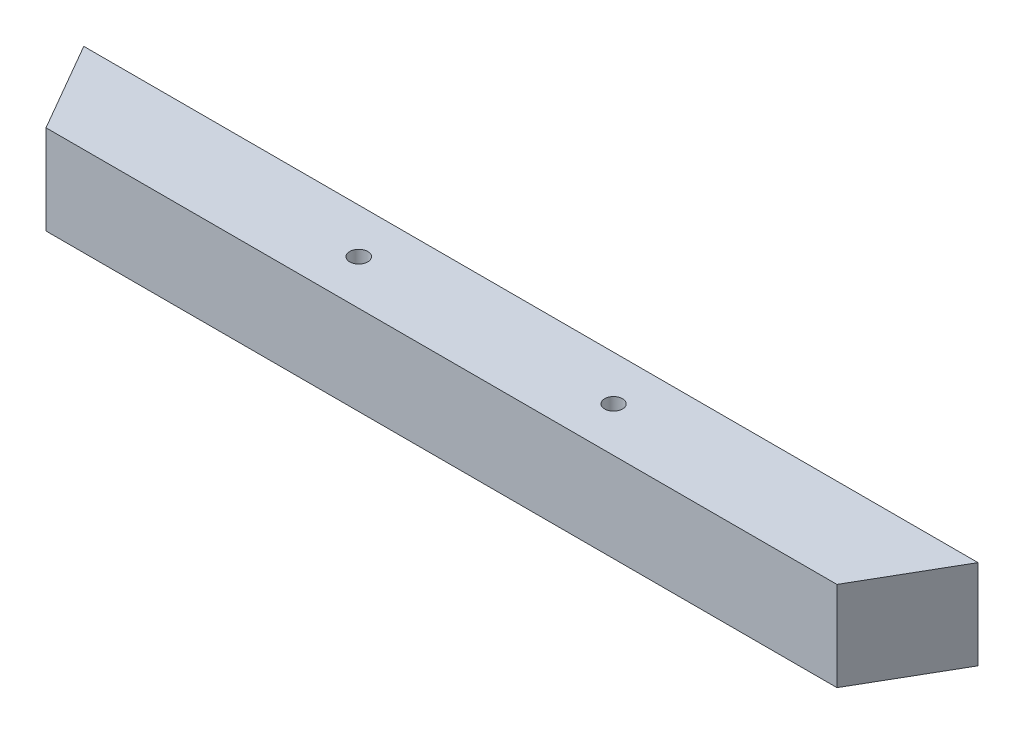
ISO-10303-21;
HEADER;
FILE_DESCRIPTION(('STEP AP214'),'2;1');
FILE_NAME('part.step','',(''),(''),'','','');
FILE_SCHEMA(('AUTOMOTIVE_DESIGN { 1 0 10303 214 1 1 1 1 }'));
ENDSEC;
DATA;
#1=APPLICATION_CONTEXT('core data for automotive mechanical design processes');
#2=APPLICATION_PROTOCOL_DEFINITION('international standard','automotive_design',2000,#1);
#3=PRODUCT_CONTEXT('',#1,'mechanical');
#4=PRODUCT('Part','Part','',(#3));
#5=PRODUCT_RELATED_PRODUCT_CATEGORY('part','',(#4));
#6=PRODUCT_DEFINITION_FORMATION('','',#4);
#7=PRODUCT_DEFINITION_CONTEXT('part definition',#1,'design');
#8=PRODUCT_DEFINITION('design','',#6,#7);
#9=PRODUCT_DEFINITION_SHAPE('','',#8);
#10=(LENGTH_UNIT() NAMED_UNIT(*) SI_UNIT(.MILLI.,.METRE.));
#11=(NAMED_UNIT(*) PLANE_ANGLE_UNIT() SI_UNIT($,.RADIAN.));
#12=(NAMED_UNIT(*) SI_UNIT($,.STERADIAN.) SOLID_ANGLE_UNIT());
#13=UNCERTAINTY_MEASURE_WITH_UNIT(LENGTH_MEASURE(1.E-05),#10,'distance_accuracy_value','');
#14=(GEOMETRIC_REPRESENTATION_CONTEXT(3) GLOBAL_UNCERTAINTY_ASSIGNED_CONTEXT((#13)) GLOBAL_UNIT_ASSIGNED_CONTEXT((#10,
#11,#12)) REPRESENTATION_CONTEXT('',''));
#15=CARTESIAN_POINT('',(0.,0.,0.));
#16=DIRECTION('',(0.,0.,1.));
#17=DIRECTION('',(1.,0.,0.));
#18=AXIS2_PLACEMENT_3D('',#15,#16,#17);
#19=CARTESIAN_POINT('',(0.,20.,0.));
#20=DIRECTION('',(0.,1.,0.));
#21=DIRECTION('',(0.,0.,1.));
#22=AXIS2_PLACEMENT_3D('',#19,#20,#21);
#23=PLANE('',#22);
#24=CARTESIAN_POINT('',(-28.5,20.,10.));
#25=DIRECTION('',(0.,1.,0.));
#26=DIRECTION('',(0.,0.,1.));
#27=AXIS2_PLACEMENT_3D('',#24,#25,#26);
#28=CIRCLE('',#27,2.01959555558853);
#29=CARTESIAN_POINT('',(-28.5,20.,12.0195955555885));
#30=VERTEX_POINT('',#29);
#31=EDGE_CURVE('E110',#30,#30,#28,.T.);
#32=ORIENTED_EDGE('',*,*,#31,.F.);
#33=EDGE_LOOP('',(#32));
#34=FACE_BOUND('',#33,.T.);
#35=DIRECTION('',(0.500000000000004,0.,-0.866025403784436));
#36=VECTOR('',#35,1.);
#37=CARTESIAN_POINT('',(100.,20.,0.));
#38=LINE('',#37,#36);
#39=CARTESIAN_POINT('',(88.4529946162073,20.,20.));
#40=VERTEX_POINT('',#39);
#41=CARTESIAN_POINT('',(100.,20.,0.));
#42=VERTEX_POINT('',#41);
#43=EDGE_CURVE('E95',#40,#42,#38,.T.);
#44=ORIENTED_EDGE('',*,*,#43,.T.);
#45=DIRECTION('',(-1.,0.,0.));
#46=VECTOR('',#45,1.);
#47=CARTESIAN_POINT('',(-100.,20.,0.));
#48=LINE('',#47,#46);
#49=CARTESIAN_POINT('',(-100.,20.,0.));
#50=VERTEX_POINT('',#49);
#51=EDGE_CURVE('E90',#42,#50,#48,.T.);
#52=ORIENTED_EDGE('',*,*,#51,.T.);
#53=DIRECTION('',(0.499999999999998,0.,0.86602540378444));
#54=VECTOR('',#53,1.);
#55=CARTESIAN_POINT('',(-100.,20.,0.));
#56=LINE('',#55,#54);
#57=CARTESIAN_POINT('',(-88.4529946162075,20.,20.));
#58=VERTEX_POINT('',#57);
#59=EDGE_CURVE('E93',#50,#58,#56,.T.);
#60=ORIENTED_EDGE('',*,*,#59,.T.);
#61=DIRECTION('',(1.,0.,0.));
#62=VECTOR('',#61,1.);
#63=CARTESIAN_POINT('',(-88.4529946162075,20.,20.));
#64=LINE('',#63,#62);
#65=EDGE_CURVE('E60',#58,#40,#64,.T.);
#66=ORIENTED_EDGE('',*,*,#65,.T.);
#67=EDGE_LOOP('',(#44,#52,#60,#66));
#68=FACE_BOUND('',#67,.T.);
#69=CARTESIAN_POINT('',(28.5,20.,9.99999999999999));
#70=DIRECTION('',(0.,1.,0.));
#71=DIRECTION('',(0.,0.,1.));
#72=AXIS2_PLACEMENT_3D('',#69,#70,#71);
#73=CIRCLE('',#72,2.);
#74=CARTESIAN_POINT('',(28.5,20.,12.));
#75=VERTEX_POINT('',#74);
#76=EDGE_CURVE('E125',#75,#75,#73,.T.);
#77=ORIENTED_EDGE('',*,*,#76,.F.);
#78=EDGE_LOOP('',(#77));
#79=FACE_BOUND('',#78,.T.);
#80=ADVANCED_FACE('F43',(#34,#68,#79),#23,.T.);
#81=CARTESIAN_POINT('',(0.,0.,0.));
#82=DIRECTION('',(0.,1.,0.));
#83=DIRECTION('',(0.,0.,1.));
#84=AXIS2_PLACEMENT_3D('',#81,#82,#83);
#85=PLANE('',#84);
#86=DIRECTION('',(0.500000000000004,0.,-0.866025403784436));
#87=VECTOR('',#86,1.);
#88=CARTESIAN_POINT('',(100.,0.,0.));
#89=LINE('',#88,#87);
#90=CARTESIAN_POINT('',(88.4529946162073,0.,20.));
#91=VERTEX_POINT('',#90);
#92=CARTESIAN_POINT('',(100.,0.,0.));
#93=VERTEX_POINT('',#92);
#94=EDGE_CURVE('E107',#91,#93,#89,.T.);
#95=ORIENTED_EDGE('',*,*,#94,.F.);
#96=DIRECTION('',(1.,0.,0.));
#97=VECTOR('',#96,1.);
#98=CARTESIAN_POINT('',(-88.4529946162075,0.,20.));
#99=LINE('',#98,#97);
#100=CARTESIAN_POINT('',(-88.4529946162075,0.,20.));
#101=VERTEX_POINT('',#100);
#102=EDGE_CURVE('E83',#101,#91,#99,.T.);
#103=ORIENTED_EDGE('',*,*,#102,.F.);
#104=DIRECTION('',(0.499999999999998,0.,0.86602540378444));
#105=VECTOR('',#104,1.);
#106=CARTESIAN_POINT('',(-100.,0.,0.));
#107=LINE('',#106,#105);
#108=CARTESIAN_POINT('',(-100.,0.,0.));
#109=VERTEX_POINT('',#108);
#110=EDGE_CURVE('E77',#109,#101,#107,.T.);
#111=ORIENTED_EDGE('',*,*,#110,.F.);
#112=DIRECTION('',(-1.,0.,0.));
#113=VECTOR('',#112,1.);
#114=CARTESIAN_POINT('',(-100.,0.,0.));
#115=LINE('',#114,#113);
#116=EDGE_CURVE('E99',#93,#109,#115,.T.);
#117=ORIENTED_EDGE('',*,*,#116,.F.);
#118=EDGE_LOOP('',(#95,#103,#111,#117));
#119=FACE_BOUND('',#118,.T.);
#120=CARTESIAN_POINT('',(-28.5,0.,10.));
#121=DIRECTION('',(0.,1.,0.));
#122=DIRECTION('',(0.,0.,1.));
#123=AXIS2_PLACEMENT_3D('',#120,#121,#122);
#124=CIRCLE('',#123,2.01959555558853);
#125=CARTESIAN_POINT('',(-28.5,0.,12.0195955555885));
#126=VERTEX_POINT('',#125);
#127=EDGE_CURVE('E122',#126,#126,#124,.T.);
#128=ORIENTED_EDGE('',*,*,#127,.T.);
#129=EDGE_LOOP('',(#128));
#130=FACE_BOUND('',#129,.T.);
#131=CARTESIAN_POINT('',(28.5,0.,9.99999999999999));
#132=DIRECTION('',(0.,1.,0.));
#133=DIRECTION('',(0.,0.,1.));
#134=AXIS2_PLACEMENT_3D('',#131,#132,#133);
#135=CIRCLE('',#134,2.);
#136=CARTESIAN_POINT('',(28.5,0.,12.));
#137=VERTEX_POINT('',#136);
#138=EDGE_CURVE('E128',#137,#137,#135,.T.);
#139=ORIENTED_EDGE('',*,*,#138,.T.);
#140=EDGE_LOOP('',(#139));
#141=FACE_BOUND('',#140,.T.);
#142=ADVANCED_FACE('F118',(#119,#130,#141),#85,.F.);
#143=CARTESIAN_POINT('',(100.,20.,0.));
#144=DIRECTION('',(-0.866025403784436,0.,-0.500000000000004));
#145=DIRECTION('',(-0.500000000000004,0.,0.866025403784436));
#146=AXIS2_PLACEMENT_3D('',#143,#144,#145);
#147=PLANE('',#146);
#148=ORIENTED_EDGE('',*,*,#94,.T.);
#149=DIRECTION('',(0.,-1.,0.));
#150=VECTOR('',#149,1.);
#151=CARTESIAN_POINT('',(100.,20.,0.));
#152=LINE('',#151,#150);
#153=EDGE_CURVE('E13',#42,#93,#152,.T.);
#154=ORIENTED_EDGE('',*,*,#153,.F.);
#155=ORIENTED_EDGE('',*,*,#43,.F.);
#156=DIRECTION('',(0.,-1.,0.));
#157=VECTOR('',#156,1.);
#158=CARTESIAN_POINT('',(88.4529946162073,20.,20.));
#159=LINE('',#158,#157);
#160=EDGE_CURVE('E103',#40,#91,#159,.T.);
#161=ORIENTED_EDGE('',*,*,#160,.T.);
#162=EDGE_LOOP('',(#148,#154,#155,#161));
#163=FACE_BOUND('',#162,.T.);
#164=ADVANCED_FACE('F45',(#163),#147,.F.);
#165=CARTESIAN_POINT('',(-100.,20.,0.));
#166=DIRECTION('',(0.,0.,1.));
#167=DIRECTION('',(1.,0.,0.));
#168=AXIS2_PLACEMENT_3D('',#165,#166,#167);
#169=PLANE('',#168);
#170=ORIENTED_EDGE('',*,*,#116,.T.);
#171=DIRECTION('',(0.,-1.,0.));
#172=VECTOR('',#171,1.);
#173=CARTESIAN_POINT('',(-100.,20.,0.));
#174=LINE('',#173,#172);
#175=EDGE_CURVE('E52',#50,#109,#174,.T.);
#176=ORIENTED_EDGE('',*,*,#175,.F.);
#177=ORIENTED_EDGE('',*,*,#51,.F.);
#178=ORIENTED_EDGE('',*,*,#153,.T.);
#179=EDGE_LOOP('',(#170,#176,#177,#178));
#180=FACE_BOUND('',#179,.T.);
#181=ADVANCED_FACE('F98',(#180),#169,.F.);
#182=CARTESIAN_POINT('',(-100.,20.,0.));
#183=DIRECTION('',(0.86602540378444,0.,-0.499999999999998));
#184=DIRECTION('',(-0.499999999999998,0.,-0.86602540378444));
#185=AXIS2_PLACEMENT_3D('',#182,#183,#184);
#186=PLANE('',#185);
#187=ORIENTED_EDGE('',*,*,#110,.T.);
#188=DIRECTION('',(0.,-1.,0.));
#189=VECTOR('',#188,1.);
#190=CARTESIAN_POINT('',(-88.4529946162075,20.,20.));
#191=LINE('',#190,#189);
#192=EDGE_CURVE('E100',#58,#101,#191,.T.);
#193=ORIENTED_EDGE('',*,*,#192,.F.);
#194=ORIENTED_EDGE('',*,*,#59,.F.);
#195=ORIENTED_EDGE('',*,*,#175,.T.);
#196=EDGE_LOOP('',(#187,#193,#194,#195));
#197=FACE_BOUND('',#196,.T.);
#198=ADVANCED_FACE('F101',(#197),#186,.F.);
#199=CARTESIAN_POINT('',(-88.4529946162075,20.,20.));
#200=DIRECTION('',(0.,0.,-1.));
#201=DIRECTION('',(-1.,0.,0.));
#202=AXIS2_PLACEMENT_3D('',#199,#200,#201);
#203=PLANE('',#202);
#204=ORIENTED_EDGE('',*,*,#102,.T.);
#205=ORIENTED_EDGE('',*,*,#160,.F.);
#206=ORIENTED_EDGE('',*,*,#65,.F.);
#207=ORIENTED_EDGE('',*,*,#192,.T.);
#208=EDGE_LOOP('',(#204,#205,#206,#207));
#209=FACE_BOUND('',#208,.T.);
#210=ADVANCED_FACE('F115',(#209),#203,.F.);
#211=CARTESIAN_POINT('',(-28.5,20.,10.));
#212=DIRECTION('',(0.,-1.,0.));
#213=DIRECTION('',(0.,0.,-1.));
#214=AXIS2_PLACEMENT_3D('',#211,#212,#213);
#215=CYLINDRICAL_SURFACE('',#214,2.01959555558853);
#216=ORIENTED_EDGE('',*,*,#31,.T.);
#217=EDGE_LOOP('',(#216));
#218=FACE_BOUND('',#217,.T.);
#219=ORIENTED_EDGE('',*,*,#127,.F.);
#220=EDGE_LOOP('',(#219));
#221=FACE_BOUND('',#220,.T.);
#222=ADVANCED_FACE('F145',(#218,#221),#215,.F.);
#223=CARTESIAN_POINT('',(28.5,20.,9.99999999999999));
#224=DIRECTION('',(0.,-1.,0.));
#225=DIRECTION('',(0.,0.,-1.));
#226=AXIS2_PLACEMENT_3D('',#223,#224,#225);
#227=CYLINDRICAL_SURFACE('',#226,2.);
#228=ORIENTED_EDGE('',*,*,#76,.T.);
#229=EDGE_LOOP('',(#228));
#230=FACE_BOUND('',#229,.T.);
#231=ORIENTED_EDGE('',*,*,#138,.F.);
#232=EDGE_LOOP('',(#231));
#233=FACE_BOUND('',#232,.T.);
#234=ADVANCED_FACE('F134',(#230,#233),#227,.F.);
#235=CLOSED_SHELL('',(#80,#142,#164,#181,#198,#210,#222,#234));
#236=MANIFOLD_SOLID_BREP('B2',#235);
#237=ADVANCED_BREP_SHAPE_REPRESENTATION('',(#18,#236),#14);
#238=SHAPE_DEFINITION_REPRESENTATION(#9,#237);
ENDSEC;
END-ISO-10303-21;
